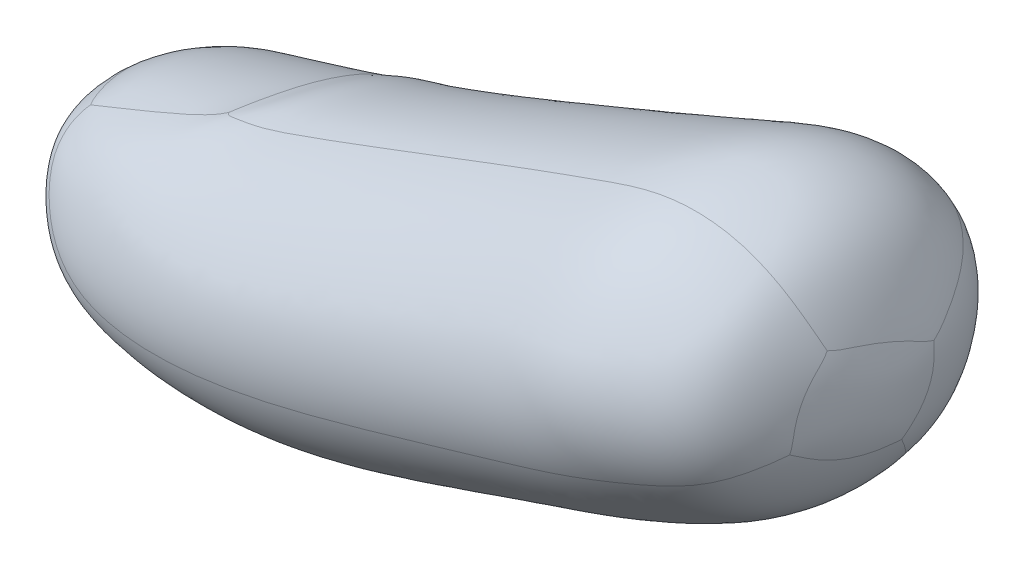
ISO-10303-21;
HEADER;
FILE_DESCRIPTION(('STEP AP214'),'2;1');
FILE_NAME('part.step','',(''),(''),'','','');
FILE_SCHEMA(('AUTOMOTIVE_DESIGN { 1 0 10303 214 1 1 1 1 }'));
ENDSEC;
DATA;
#1=APPLICATION_CONTEXT('core data for automotive mechanical design processes');
#2=APPLICATION_PROTOCOL_DEFINITION('international standard','automotive_design',2000,#1);
#3=PRODUCT_CONTEXT('',#1,'mechanical');
#4=PRODUCT('Part','Part','',(#3));
#5=PRODUCT_RELATED_PRODUCT_CATEGORY('part','',(#4));
#6=PRODUCT_DEFINITION_FORMATION('','',#4);
#7=PRODUCT_DEFINITION_CONTEXT('part definition',#1,'design');
#8=PRODUCT_DEFINITION('design','',#6,#7);
#9=PRODUCT_DEFINITION_SHAPE('','',#8);
#10=(LENGTH_UNIT() NAMED_UNIT(*) SI_UNIT(.MILLI.,.METRE.));
#11=(NAMED_UNIT(*) PLANE_ANGLE_UNIT() SI_UNIT($,.RADIAN.));
#12=(NAMED_UNIT(*) SI_UNIT($,.STERADIAN.) SOLID_ANGLE_UNIT());
#13=UNCERTAINTY_MEASURE_WITH_UNIT(LENGTH_MEASURE(1.E-05),#10,'distance_accuracy_value','');
#14=(GEOMETRIC_REPRESENTATION_CONTEXT(3) GLOBAL_UNCERTAINTY_ASSIGNED_CONTEXT((#13)) GLOBAL_UNIT_ASSIGNED_CONTEXT((#10,
#11,#12)) REPRESENTATION_CONTEXT('',''));
#15=CARTESIAN_POINT('',(0.,0.,0.));
#16=DIRECTION('',(0.,0.,1.));
#17=DIRECTION('',(1.,0.,0.));
#18=AXIS2_PLACEMENT_3D('',#15,#16,#17);
#19=CARTESIAN_POINT('',(-797.41223653979,1287.17299895486,-62.9935891354921));
#20=CARTESIAN_POINT('',(-797.009662963599,1287.28519680311,-63.2002993937446));
#21=CARTESIAN_POINT('',(-795.672419086408,1287.63969347436,-63.3725018589714));
#22=CARTESIAN_POINT('',(-793.668841404757,1288.33763641961,-63.5268892511794));
#23=CARTESIAN_POINT('',(-793.142389482528,1288.6110869806,-63.5393623579431));
#24=CARTESIAN_POINT('',(-792.963419483738,1288.79228448223,-63.4308098819067));
#25=CARTESIAN_POINT('',(-797.533078305331,1286.83508857179,-63.0166200379873));
#26=CARTESIAN_POINT('',(-796.84877291847,1286.72157388521,-63.4530714570095));
#27=CARTESIAN_POINT('',(-795.442847496479,1287.08382219586,-63.7313881127067));
#28=CARTESIAN_POINT('',(-793.53760208991,1287.88568427165,-63.9227970151909));
#29=CARTESIAN_POINT('',(-793.112873406118,1288.25916891389,-63.904342962774));
#30=CARTESIAN_POINT('',(-792.859176446138,1288.70692419971,-63.5590239463257));
#31=CARTESIAN_POINT('',(-798.165505891494,1285.49903019368,-62.521270285188));
#32=CARTESIAN_POINT('',(-797.288529056278,1285.50314502233,-63.1310010997051));
#33=CARTESIAN_POINT('',(-795.183320317249,1285.97390861126,-63.8174882878601));
#34=CARTESIAN_POINT('',(-793.156228824508,1287.31911805233,-64.1228957752211));
#35=CARTESIAN_POINT('',(-792.618550788941,1288.21587504562,-63.9979728594162));
#36=CARTESIAN_POINT('',(-792.359676645059,1288.79024346393,-63.6234619384396));
#37=CARTESIAN_POINT('',(-796.351515068194,1282.97871649903,-61.0308385031853));
#38=CARTESIAN_POINT('',(-795.493855054974,1283.30610138635,-61.9120081542899));
#39=CARTESIAN_POINT('',(-793.543550147985,1284.60379174971,-63.5074514996559));
#40=CARTESIAN_POINT('',(-792.007881748042,1286.74300828831,-64.3461099508554));
#41=CARTESIAN_POINT('',(-791.509320708268,1288.24636633131,-64.1023084785329));
#42=CARTESIAN_POINT('',(-791.326449599629,1288.95660443085,-63.6946496232852));
#43=CARTESIAN_POINT('',(-793.612528855527,1281.80148716396,-60.0658172232996));
#44=CARTESIAN_POINT('',(-793.070136415164,1282.20150433369,-61.0724770976875));
#45=CARTESIAN_POINT('',(-791.543687196439,1283.86335783618,-63.0561442141634));
#46=CARTESIAN_POINT('',(-790.525541028584,1286.51484311122,-64.4438423973524));
#47=CARTESIAN_POINT('',(-790.320842522823,1288.34953054084,-64.1561508918279));
#48=CARTESIAN_POINT('',(-790.234933903867,1289.13752980326,-63.7339954386459));
#49=CARTESIAN_POINT('',(-789.454731134139,1281.9841786437,-59.9815852341515));
#50=CARTESIAN_POINT('',(-789.182559879398,1282.39185351471,-61.0839265259536));
#51=CARTESIAN_POINT('',(-788.691089132263,1283.8240095798,-63.0913888586139));
#52=CARTESIAN_POINT('',(-788.103583179572,1287.18380093155,-64.6537649243692));
#53=CARTESIAN_POINT('',(-787.899541614799,1289.07672601446,-64.2872535256232));
#54=CARTESIAN_POINT('',(-787.860863143655,1289.8746764999,-63.8408280893228));
#55=CARTESIAN_POINT('',(-785.098427004622,1282.94687784199,-60.4267961981447));
#56=CARTESIAN_POINT('',(-784.864957655982,1283.43806064811,-61.5789093934558));
#57=CARTESIAN_POINT('',(-784.495419222226,1284.98028149854,-63.5571619268485));
#58=CARTESIAN_POINT('',(-784.042816514749,1288.47417911615,-64.9203931887374));
#59=CARTESIAN_POINT('',(-783.984411753044,1290.44048873931,-64.4846431832493));
#60=CARTESIAN_POINT('',(-784.004087314472,1291.26005135395,-64.0180470297201));
#61=CARTESIAN_POINT('',(-780.614340868256,1284.44028985914,-60.9278201320146));
#62=CARTESIAN_POINT('',(-780.357647619007,1284.97629042749,-62.0735339559628));
#63=CARTESIAN_POINT('',(-779.86755179198,1286.60740330709,-63.94963899637));
#64=CARTESIAN_POINT('',(-779.035374197738,1290.30737172252,-65.1328677179104));
#65=CARTESIAN_POINT('',(-778.752429589177,1292.43373590267,-64.6815991938362));
#66=CARTESIAN_POINT('',(-778.741061202132,1293.30012795418,-64.2018212301244));
#67=CARTESIAN_POINT('',(-776.227744159065,1286.03490554382,-61.283882648179));
#68=CARTESIAN_POINT('',(-776.04391254579,1286.54775291902,-62.4092558011296));
#69=CARTESIAN_POINT('',(-775.696975284693,1288.09372117291,-64.1795869377831));
#70=CARTESIAN_POINT('',(-775.698628608873,1291.47270776986,-65.1978612227999));
#71=CARTESIAN_POINT('',(-775.550967597177,1293.61740824296,-64.7305176424093));
#72=CARTESIAN_POINT('',(-775.60049049293,1294.5082313703,-64.2386288517891));
#73=CARTESIAN_POINT('',(-773.196398259698,1287.09374037915,-61.3926094458694));
#74=CARTESIAN_POINT('',(-773.053780970017,1287.57992354266,-62.5203265404129));
#75=CARTESIAN_POINT('',(-772.795140347196,1289.02917973234,-64.2710276657517));
#76=CARTESIAN_POINT('',(-772.361797568962,1292.63804382509,-65.2628436208054));
#77=CARTESIAN_POINT('',(-772.349476976405,1294.80108012848,-64.7794337162245));
#78=CARTESIAN_POINT('',(-772.459904518622,1295.71633758827,-64.2754371871515));
#79=CARTESIAN_POINT('',(-770.726393127656,1288.02325979308,-61.0056570959923));
#80=CARTESIAN_POINT('',(-770.598341033351,1288.45975276591,-62.0181251606208));
#81=CARTESIAN_POINT('',(-770.366115590796,1289.76088958678,-63.5899068385854));
#82=CARTESIAN_POINT('',(-769.977003930839,1293.00093857234,-64.4803545246217));
#83=CARTESIAN_POINT('',(-769.965975121647,1294.94293116809,-64.0463529760575));
#84=CARTESIAN_POINT('',(-770.06512929119,1295.76465653854,-63.5938637896889));
#85=CARTESIAN_POINT('',(-768.663995236277,1289.10097557716,-60.0497751628274));
#86=CARTESIAN_POINT('',(-768.565724787693,1289.4329930005,-60.8516191493285));
#87=CARTESIAN_POINT('',(-768.387501814803,1290.43280102252,-62.1143064819325));
#88=CARTESIAN_POINT('',(-768.330931380667,1292.9199719392,-62.845311782667));
#89=CARTESIAN_POINT('',(-768.326612022491,1294.42002745158,-62.4748152107174));
#90=CARTESIAN_POINT('',(-768.399576072669,1295.06081669551,-62.1048173319555));
#91=CARTESIAN_POINT('',(-767.980617683395,1290.55939492903,-59.0650601909013));
#92=CARTESIAN_POINT('',(-767.934242206241,1290.73886862783,-59.5505069520397));
#93=CARTESIAN_POINT('',(-767.834884337309,1291.37922379919,-60.26604517765));
#94=CARTESIAN_POINT('',(-767.672012670562,1292.92353313764,-60.7310358847111));
#95=CARTESIAN_POINT('',(-767.660284262554,1293.81482003253,-60.5661024453015));
#96=CARTESIAN_POINT('',(-767.691224220742,1294.18111896036,-60.3226256757653));
#97=CARTESIAN_POINT('',(-767.858716914211,1290.86486395098,-58.8563385306816));
#98=CARTESIAN_POINT('',(-767.774578791038,1291.10733531136,-58.9947010811301));
#99=CARTESIAN_POINT('',(-767.68045833405,1291.71791212349,-59.5459108477235));
#100=CARTESIAN_POINT('',(-767.556944119164,1292.98712365776,-59.9480548744773));
#101=CARTESIAN_POINT('',(-767.557588531359,1293.73533754585,-59.8964874238842));
#102=CARTESIAN_POINT('',(-767.612447080552,1294.00603099329,-59.9573745846767));
#103=(BOUNDED_SURFACE() B_SPLINE_SURFACE(3,3,((#19,#20,#21,#22,#23,#24),(#25,#26,#27,#28,#29,
#30),(#31,#32,#33,#34,#35,#36),(#37,#38,#39,#40,#41,#42),(#43,#44,#45,#46,#47,#48),(#49,#50,#51,
#52,#53,#54),(#55,#56,#57,#58,#59,#60),(#61,#62,#63,#64,#65,#66),(#67,#68,#69,#70,#71,#72),(#73,
#74,#75,#76,#77,#78),(#79,#80,#81,#82,#83,#84),(#85,#86,#87,#88,#89,#90),(#91,#92,#93,#94,#95,
#96),(#97,#98,#99,#100,#101,#102)),.UNSPECIFIED.,.F.,.F.,.F.) B_SPLINE_SURFACE_WITH_KNOTS((4,1,
1,1,1,1,1,1,1,1,1,4),(4,1,1,4),(0.,1.,2.,3.,4.,5.,6.,7.,8.,9.,10.,11.),(0.,1.,2.,3.),
.UNSPECIFIED.) GEOMETRIC_REPRESENTATION_ITEM() RATIONAL_B_SPLINE_SURFACE(((0.75,1.,1.,1.,1.,
0.75),(1.,1.,1.,1.,1.,1.),(1.,1.,1.,1.,1.,1.),(1.,1.,1.,1.,1.,1.),(1.,1.,1.,1.,1.,1.),(1.,1.,1.,
1.,1.,1.),(1.,1.,1.,1.,1.,1.),(1.,1.,1.,1.,1.,1.),(1.,1.,1.,1.,1.,1.),(1.,1.,1.,1.,1.,1.),(1.,
1.,1.,1.,1.,1.),(1.,1.,1.,1.,1.,1.),(1.,1.,1.,1.,1.,1.),(0.75,1.,1.,1.,1.,0.75))) REPRESENTATION_ITEM('') SURFACE());
#104=CARTESIAN_POINT('',(-767.858716914211,1290.86486395098,-58.8563385306816));
#105=CARTESIAN_POINT('',(-767.980617683395,1290.55939492903,-59.0650601909013));
#106=CARTESIAN_POINT('',(-768.663995236277,1289.10097557716,-60.0497751628274));
#107=CARTESIAN_POINT('',(-770.726393127656,1288.02325979308,-61.0056570959923));
#108=CARTESIAN_POINT('',(-773.196398259698,1287.09374037915,-61.3926094458694));
#109=CARTESIAN_POINT('',(-776.227744159065,1286.03490554382,-61.283882648179));
#110=CARTESIAN_POINT('',(-780.614340868256,1284.44028985914,-60.9278201320146));
#111=CARTESIAN_POINT('',(-785.098427004622,1282.94687784199,-60.4267961981447));
#112=CARTESIAN_POINT('',(-789.454731134139,1281.9841786437,-59.9815852341515));
#113=CARTESIAN_POINT('',(-793.612528855527,1281.80148716396,-60.0658172232996));
#114=CARTESIAN_POINT('',(-796.351515068194,1282.97871649903,-61.0308385031853));
#115=CARTESIAN_POINT('',(-798.165505891494,1285.49903019368,-62.521270285188));
#116=CARTESIAN_POINT('',(-797.533078305331,1286.83508857179,-63.0166200379873));
#117=CARTESIAN_POINT('',(-797.41223653979,1287.17299895486,-62.9935891354921));
#118=(BOUNDED_CURVE() B_SPLINE_CURVE(3,(#104,#105,#106,#107,#108,#109,#110,#111,#112,#113,#114,
#115,#116,#117),.UNSPECIFIED.,.F.,.F.) B_SPLINE_CURVE_WITH_KNOTS((4,1,1,1,1,1,1,1,1,1,1,4),(0.,
1.,2.,3.,4.,5.,6.,7.,8.,9.,10.,11.),
.UNSPECIFIED.) CURVE() GEOMETRIC_REPRESENTATION_ITEM() RATIONAL_B_SPLINE_CURVE((0.75,1.,1.,1.,
1.,1.,1.,1.,1.,1.,1.,1.,1.,0.75)) REPRESENTATION_ITEM(''));
#119=CARTESIAN_POINT('',(-767.858716914211,1290.86486395098,-58.8563385306816));
#120=VERTEX_POINT('',#119);
#121=CARTESIAN_POINT('',(-797.41223653979,1287.17299895486,-62.9935891354921));
#122=VERTEX_POINT('',#121);
#123=EDGE_CURVE('E90',#120,#122,#118,.T.);
#124=CARTESIAN_POINT('',(-797.41223653979,1287.17299895486,-62.9935891354921));
#125=CARTESIAN_POINT('',(-797.009662963599,1287.28519680311,-63.2002993937446));
#126=CARTESIAN_POINT('',(-795.672419086408,1287.63969347436,-63.3725018589714));
#127=CARTESIAN_POINT('',(-793.668841404757,1288.33763641961,-63.5268892511794));
#128=CARTESIAN_POINT('',(-793.142389482528,1288.6110869806,-63.5393623579431));
#129=CARTESIAN_POINT('',(-792.963419483738,1288.79228448223,-63.4308098819067));
#130=(BOUNDED_CURVE() B_SPLINE_CURVE(3,(#124,#125,#126,#127,#128,#129),.UNSPECIFIED.,.F.,
.F.) B_SPLINE_CURVE_WITH_KNOTS((4,1,1,4),(0.,1.,2.,3.),
.UNSPECIFIED.) CURVE() GEOMETRIC_REPRESENTATION_ITEM() RATIONAL_B_SPLINE_CURVE((0.75,1.,1.,1.,
1.,0.75)) REPRESENTATION_ITEM(''));
#131=CARTESIAN_POINT('',(-792.963419483738,1288.79228448223,-63.4308098819067));
#132=VERTEX_POINT('',#131);
#133=EDGE_CURVE('E75',#122,#132,#130,.T.);
#134=CARTESIAN_POINT('',(-792.963419483738,1288.79228448223,-63.4308098819067));
#135=CARTESIAN_POINT('',(-792.859176446138,1288.70692419971,-63.5590239463257));
#136=CARTESIAN_POINT('',(-792.359676645059,1288.79024346393,-63.6234619384396));
#137=CARTESIAN_POINT('',(-791.326449599629,1288.95660443085,-63.6946496232852));
#138=CARTESIAN_POINT('',(-790.234933903867,1289.13752980326,-63.7339954386459));
#139=CARTESIAN_POINT('',(-787.860863143655,1289.8746764999,-63.8408280893228));
#140=CARTESIAN_POINT('',(-784.004087314472,1291.26005135395,-64.0180470297201));
#141=CARTESIAN_POINT('',(-778.741061202132,1293.30012795418,-64.2018212301244));
#142=CARTESIAN_POINT('',(-775.60049049293,1294.5082313703,-64.2386288517891));
#143=CARTESIAN_POINT('',(-772.459904518622,1295.71633758827,-64.2754371871515));
#144=CARTESIAN_POINT('',(-770.06512929119,1295.76465653854,-63.5938637896889));
#145=CARTESIAN_POINT('',(-768.399576072669,1295.06081669551,-62.1048173319555));
#146=CARTESIAN_POINT('',(-767.691224220742,1294.18111896036,-60.3226256757653));
#147=CARTESIAN_POINT('',(-767.612447080552,1294.00603099329,-59.9573745846767));
#148=(BOUNDED_CURVE() B_SPLINE_CURVE(3,(#134,#135,#136,#137,#138,#139,#140,#141,#142,#143,#144,
#145,#146,#147),.UNSPECIFIED.,.F.,.F.) B_SPLINE_CURVE_WITH_KNOTS((4,1,1,1,1,1,1,1,1,1,1,4),(0.,
1.,2.,3.,4.,5.,6.,7.,8.,9.,10.,11.),
.UNSPECIFIED.) CURVE() GEOMETRIC_REPRESENTATION_ITEM() RATIONAL_B_SPLINE_CURVE((0.75,1.,1.,1.,
1.,1.,1.,1.,1.,1.,1.,1.,1.,0.75)) REPRESENTATION_ITEM(''));
#149=CARTESIAN_POINT('',(-767.612447080552,1294.00603099329,-59.9573745846767));
#150=VERTEX_POINT('',#149);
#151=EDGE_CURVE('E105',#132,#150,#148,.T.);
#152=CARTESIAN_POINT('',(-767.858716914211,1290.86486395098,-58.8563385306816));
#153=CARTESIAN_POINT('',(-767.774578791038,1291.10733531136,-58.9947010811301));
#154=CARTESIAN_POINT('',(-767.68045833405,1291.71791212349,-59.5459108477235));
#155=CARTESIAN_POINT('',(-767.556944119164,1292.98712365776,-59.9480548744773));
#156=CARTESIAN_POINT('',(-767.557588531359,1293.73533754585,-59.8964874238842));
#157=CARTESIAN_POINT('',(-767.612447080552,1294.00603099329,-59.9573745846767));
#158=(BOUNDED_CURVE() B_SPLINE_CURVE(3,(#152,#153,#154,#155,#156,#157),.UNSPECIFIED.,.F.,
.F.) B_SPLINE_CURVE_WITH_KNOTS((4,1,1,4),(0.,1.,2.,3.),
.UNSPECIFIED.) CURVE() GEOMETRIC_REPRESENTATION_ITEM() RATIONAL_B_SPLINE_CURVE((0.75,1.,1.,1.,
1.,0.75)) REPRESENTATION_ITEM(''));
#159=EDGE_CURVE('E93',#150,#120,#158,.F.);
#160=ORIENTED_EDGE('',*,*,#123,.T.);
#161=ORIENTED_EDGE('',*,*,#133,.T.);
#162=ORIENTED_EDGE('',*,*,#151,.T.);
#163=ORIENTED_EDGE('',*,*,#159,.T.);
#164=EDGE_LOOP('',(#160,#161,#162,#163));
#165=FACE_BOUND('',#164,.T.);
#166=ADVANCED_FACE('F33',(#165),#103,.F.);
#167=CARTESIAN_POINT('',(-767.858716914211,1290.86486395098,-58.8563385306816));
#168=CARTESIAN_POINT('',(-767.774578791038,1291.10733531136,-58.9947010811301));
#169=CARTESIAN_POINT('',(-767.68045833405,1291.71791212349,-59.5459108477235));
#170=CARTESIAN_POINT('',(-767.556944119164,1292.98712365776,-59.9480548744773));
#171=CARTESIAN_POINT('',(-767.557588531359,1293.73533754585,-59.8964874238842));
#172=CARTESIAN_POINT('',(-767.612447080552,1294.00603099329,-59.9573745846767));
#173=CARTESIAN_POINT('',(-767.820954268173,1290.92786161256,-58.5092543199808));
#174=CARTESIAN_POINT('',(-767.614915375833,1291.47580199488,-58.4388952102314));
#175=CARTESIAN_POINT('',(-767.526032330791,1292.05660044781,-58.8257765177861));
#176=CARTESIAN_POINT('',(-767.441875567766,1293.05071417789,-59.1650738642435));
#177=CARTESIAN_POINT('',(-767.454892800163,1293.65585505917,-59.2268724024669));
#178=CARTESIAN_POINT('',(-767.588528489555,1294.10163647368,-59.6530106543697));
#179=CARTESIAN_POINT('',(-767.860440748285,1290.97308735402,-57.4350742673072));
#180=CARTESIAN_POINT('',(-767.607744296452,1291.64379310166,-57.5167839238708));
#181=CARTESIAN_POINT('',(-767.460945795234,1292.46493096839,-57.7935005023082));
#182=CARTESIAN_POINT('',(-767.41166965352,1293.32531178539,-58.1345096436654));
#183=CARTESIAN_POINT('',(-767.481587216558,1293.96692925695,-58.4442090046586));
#184=CARTESIAN_POINT('',(-767.669619818126,1294.54412798076,-58.8571921361414));
#185=CARTESIAN_POINT('',(-768.049070594386,1291.47210496343,-55.7503315317923));
#186=CARTESIAN_POINT('',(-767.764077573183,1292.06448029126,-56.1210180395691));
#187=CARTESIAN_POINT('',(-767.619089276518,1292.8448329563,-56.4848029411818));
#188=CARTESIAN_POINT('',(-767.587853958583,1293.77393648092,-56.9202859708017));
#189=CARTESIAN_POINT('',(-767.684518558303,1294.36858647968,-57.1966052727144));
#190=CARTESIAN_POINT('',(-767.923428278138,1294.99045316303,-57.3963183795086));
#191=CARTESIAN_POINT('',(-768.162632713578,1292.07764881348,-54.8915966453215));
#192=CARTESIAN_POINT('',(-767.928449386946,1292.48679480355,-55.3049553025182));
#193=CARTESIAN_POINT('',(-767.894480921089,1293.18028633337,-55.4385124594952));
#194=CARTESIAN_POINT('',(-767.884798688657,1294.14397141874,-55.9469032064313));
#195=CARTESIAN_POINT('',(-767.904043249297,1294.58078387283,-56.366321828175));
#196=CARTESIAN_POINT('',(-768.132471475574,1295.11440624349,-56.4347229917651));
#197=CARTESIAN_POINT('',(-768.257645369836,1292.23475085663,-54.5963084958512));
#198=CARTESIAN_POINT('',(-768.188060034648,1292.51787487326,-54.6553437497144));
#199=CARTESIAN_POINT('',(-768.190554231571,1293.35068616389,-54.7003200549341));
#200=CARTESIAN_POINT('',(-768.188942105985,1294.54509880206,-55.3643513235413));
#201=CARTESIAN_POINT('',(-768.187596063127,1295.00339063332,-55.9656843174954));
#202=CARTESIAN_POINT('',(-768.245363942696,1295.21826996027,-56.1448309301154));
#203=(BOUNDED_SURFACE() B_SPLINE_SURFACE(3,3,((#167,#168,#169,#170,#171,#172),(#173,#174,#175,
#176,#177,#178),(#179,#180,#181,#182,#183,#184),(#185,#186,#187,#188,#189,#190),(#191,#192,#193,
#194,#195,#196),(#197,#198,#199,#200,#201,#202)),.UNSPECIFIED.,.F.,.F.,
.F.) B_SPLINE_SURFACE_WITH_KNOTS((4,1,1,4),(4,1,1,4),(0.,1.,2.,3.),(0.,1.,2.,3.),
.UNSPECIFIED.) GEOMETRIC_REPRESENTATION_ITEM() RATIONAL_B_SPLINE_SURFACE(((0.75,1.,1.,1.,1.,
0.75),(1.,1.,1.,1.,1.,1.),(1.,1.,1.,1.,1.,1.),(1.,1.,1.,1.,1.,1.),(1.,1.,1.,1.,1.,1.),(0.75,1.,
1.,1.,1.,0.75))) REPRESENTATION_ITEM('') SURFACE());
#204=CARTESIAN_POINT('',(-767.858716914211,1290.86486395098,-58.8563385306816));
#205=CARTESIAN_POINT('',(-767.820954268173,1290.92786161256,-58.5092543199808));
#206=CARTESIAN_POINT('',(-767.860440748285,1290.97308735402,-57.4350742673072));
#207=CARTESIAN_POINT('',(-768.049070594386,1291.47210496343,-55.7503315317923));
#208=CARTESIAN_POINT('',(-768.162632713578,1292.07764881348,-54.8915966453215));
#209=CARTESIAN_POINT('',(-768.257645369836,1292.23475085663,-54.5963084958512));
#210=(BOUNDED_CURVE() B_SPLINE_CURVE(3,(#204,#205,#206,#207,#208,#209),.UNSPECIFIED.,.F.,
.F.) B_SPLINE_CURVE_WITH_KNOTS((4,1,1,4),(0.,1.,2.,3.),
.UNSPECIFIED.) CURVE() GEOMETRIC_REPRESENTATION_ITEM() RATIONAL_B_SPLINE_CURVE((0.75,1.,1.,1.,
1.,0.75)) REPRESENTATION_ITEM(''));
#211=CARTESIAN_POINT('',(-768.257645369835,1292.23475085663,-54.5963084958512));
#212=VERTEX_POINT('',#211);
#213=EDGE_CURVE('E85',#212,#120,#210,.F.);
#214=CARTESIAN_POINT('',(-767.612447080552,1294.00603099329,-59.9573745846767));
#215=CARTESIAN_POINT('',(-767.588528489555,1294.10163647368,-59.6530106543697));
#216=CARTESIAN_POINT('',(-767.669619818126,1294.54412798076,-58.8571921361414));
#217=CARTESIAN_POINT('',(-767.923428278138,1294.99045316303,-57.3963183795086));
#218=CARTESIAN_POINT('',(-768.132471475574,1295.11440624349,-56.4347229917651));
#219=CARTESIAN_POINT('',(-768.245363942696,1295.21826996027,-56.1448309301154));
#220=(BOUNDED_CURVE() B_SPLINE_CURVE(3,(#214,#215,#216,#217,#218,#219),.UNSPECIFIED.,.F.,
.F.) B_SPLINE_CURVE_WITH_KNOTS((4,1,1,4),(0.,1.,2.,3.),
.UNSPECIFIED.) CURVE() GEOMETRIC_REPRESENTATION_ITEM() RATIONAL_B_SPLINE_CURVE((0.75,1.,1.,1.,
1.,0.75)) REPRESENTATION_ITEM(''));
#221=CARTESIAN_POINT('',(-768.245363942696,1295.21826996027,-56.1448309301153));
#222=VERTEX_POINT('',#221);
#223=EDGE_CURVE('E112',#150,#222,#220,.T.);
#224=CARTESIAN_POINT('',(-768.257645369836,1292.23475085663,-54.5963084958512));
#225=CARTESIAN_POINT('',(-768.188060034648,1292.51787487326,-54.6553437497144));
#226=CARTESIAN_POINT('',(-768.190554231571,1293.35068616389,-54.7003200549341));
#227=CARTESIAN_POINT('',(-768.188942105985,1294.54509880206,-55.3643513235413));
#228=CARTESIAN_POINT('',(-768.187596063127,1295.00339063332,-55.9656843174954));
#229=CARTESIAN_POINT('',(-768.245363942696,1295.21826996027,-56.1448309301154));
#230=(BOUNDED_CURVE() B_SPLINE_CURVE(3,(#224,#225,#226,#227,#228,#229),.UNSPECIFIED.,.F.,
.F.) B_SPLINE_CURVE_WITH_KNOTS((4,1,1,4),(0.,1.,2.,3.),
.UNSPECIFIED.) CURVE() GEOMETRIC_REPRESENTATION_ITEM() RATIONAL_B_SPLINE_CURVE((0.75,1.,1.,1.,
1.,0.75)) REPRESENTATION_ITEM(''));
#231=EDGE_CURVE('E54',#222,#212,#230,.F.);
#232=ORIENTED_EDGE('',*,*,#213,.T.);
#233=ORIENTED_EDGE('',*,*,#159,.F.);
#234=ORIENTED_EDGE('',*,*,#223,.T.);
#235=ORIENTED_EDGE('',*,*,#231,.T.);
#236=EDGE_LOOP('',(#232,#233,#234,#235));
#237=FACE_BOUND('',#236,.T.);
#238=ADVANCED_FACE('F166',(#237),#203,.F.);
#239=CARTESIAN_POINT('',(-792.963419483738,1288.79228448223,-63.4308098819067));
#240=CARTESIAN_POINT('',(-792.888692522547,1289.05884226641,-63.1940433414839));
#241=CARTESIAN_POINT('',(-792.405533788697,1290.44979971617,-61.8294860734332));
#242=CARTESIAN_POINT('',(-792.471508457402,1291.54753107883,-58.6683872456036));
#243=CARTESIAN_POINT('',(-793.012090241742,1291.39643204746,-56.5686000588031));
#244=CARTESIAN_POINT('',(-793.136797075662,1291.34153504251,-56.1777845356879));
#245=CARTESIAN_POINT('',(-792.859176446138,1288.70692419971,-63.5590239463257));
#246=CARTESIAN_POINT('',(-792.605479486147,1289.15467948552,-63.2137049298555));
#247=CARTESIAN_POINT('',(-792.015420329977,1290.57221598653,-61.8508829164464));
#248=CARTESIAN_POINT('',(-792.0682472325,1291.69096413703,-58.7097057405986));
#249=CARTESIAN_POINT('',(-792.694499514472,1291.52340807774,-56.5967807110266));
#250=CARTESIAN_POINT('',(-793.040355128991,1291.37757455518,-55.9964671002421));
#251=CARTESIAN_POINT('',(-792.359676645059,1288.79024346393,-63.6234619384396));
#252=CARTESIAN_POINT('',(-792.100802501186,1289.36461188225,-63.2489510174412));
#253=CARTESIAN_POINT('',(-791.602983961261,1290.76532856224,-61.8758302492854));
#254=CARTESIAN_POINT('',(-791.70028719864,1291.87456590464,-58.7486357557308));
#255=CARTESIAN_POINT('',(-792.310309970548,1291.72403638306,-56.6294691344165));
#256=CARTESIAN_POINT('',(-792.677334488182,1291.50749472503,-55.9118700668459));
#257=CARTESIAN_POINT('',(-791.326449599629,1288.95660443085,-63.6946496232852));
#258=CARTESIAN_POINT('',(-791.143578491009,1289.6668425304,-63.2869907680374));
#259=CARTESIAN_POINT('',(-790.910655096256,1291.0044368856,-61.900156819369));
#260=CARTESIAN_POINT('',(-791.041192387042,1292.10652067138,-58.7834279085633));
#261=CARTESIAN_POINT('',(-791.639100072375,1291.96876129559,-56.6595867789358));
#262=CARTESIAN_POINT('',(-791.958839870789,1291.6981313765,-55.8146051566991));
#263=CARTESIAN_POINT('',(-790.234933903867,1289.13752980326,-63.7339954386459));
#264=CARTESIAN_POINT('',(-790.149025284912,1289.92552906569,-63.3118399854639));
#265=CARTESIAN_POINT('',(-790.010089314861,1291.24283868574,-61.9109096782604));
#266=CARTESIAN_POINT('',(-790.219774540712,1292.32548846123,-58.811103698913));
#267=CARTESIAN_POINT('',(-790.757728829759,1292.22262483803,-56.6797027364767));
#268=CARTESIAN_POINT('',(-791.033194145582,1291.93694393439,-55.7655573934477));
#269=CARTESIAN_POINT('',(-787.860863143655,1289.8746764999,-63.8408280893228));
#270=CARTESIAN_POINT('',(-787.82218467251,1290.67262698534,-63.3944026530225));
#271=CARTESIAN_POINT('',(-787.871512352735,1291.9715038442,-61.9752123065995));
#272=CARTESIAN_POINT('',(-788.100152141968,1293.03709060229,-58.892312865551));
#273=CARTESIAN_POINT('',(-788.553990297404,1292.96632357885,-56.7462472668765));
#274=CARTESIAN_POINT('',(-788.790384601963,1292.70498299198,-55.8116687060021));
#275=CARTESIAN_POINT('',(-784.004087314472,1291.26005135395,-64.0180470297201));
#276=CARTESIAN_POINT('',(-784.023762875899,1292.07961396857,-63.5514508761909));
#277=CARTESIAN_POINT('',(-784.160869883297,1293.39155480397,-62.1208162675514));
#278=CARTESIAN_POINT('',(-784.678223037182,1294.29014873968,-59.0232983283016));
#279=CARTESIAN_POINT('',(-785.140248631718,1294.19285241321,-56.8594035811445));
#280=CARTESIAN_POINT('',(-785.360169400154,1293.94228311116,-55.8873619915583));
#281=CARTESIAN_POINT('',(-778.741061202132,1293.30012795418,-64.2018212301244));
#282=CARTESIAN_POINT('',(-778.729692815097,1294.16652000568,-63.7220432663907));
#283=CARTESIAN_POINT('',(-778.967163875526,1295.50572403158,-62.2541999355301));
#284=CARTESIAN_POINT('',(-779.61235639276,1296.34448008759,-59.0441463016271));
#285=CARTESIAN_POINT('',(-780.151485911413,1296.18389050033,-56.7978263603931));
#286=CARTESIAN_POINT('',(-780.42055853575,1295.89388800416,-55.7824007560304));
#287=CARTESIAN_POINT('',(-775.60049049293,1294.5082313703,-64.2386288517891));
#288=CARTESIAN_POINT('',(-775.650013388683,1295.39905449764,-63.746740061169));
#289=CARTESIAN_POINT('',(-775.995765983389,1296.8176465339,-62.2465284790681));
#290=CARTESIAN_POINT('',(-776.666386621411,1297.72937875317,-58.8887114096238));
#291=CARTESIAN_POINT('',(-777.098404347987,1297.52625141614,-56.5232935594187));
#292=CARTESIAN_POINT('',(-777.231136759519,1297.23675661351,-55.4605057625959));
#293=CARTESIAN_POINT('',(-772.459904518622,1295.71633758827,-64.2754371871515));
#294=CARTESIAN_POINT('',(-772.57033206083,1296.63159504805,-63.7714406580785));
#295=CARTESIAN_POINT('',(-773.024362822208,1298.1295885838,-62.2388644463566));
#296=CARTESIAN_POINT('',(-773.720411617317,1299.11429708066,-58.7332836094994));
#297=CARTESIAN_POINT('',(-774.045374640075,1298.86863236979,-56.2487741486124));
#298=CARTESIAN_POINT('',(-774.126505338641,1298.54840059337,-55.1485205596987));
#299=CARTESIAN_POINT('',(-770.06512929119,1295.76465653854,-63.5938637896889));
#300=CARTESIAN_POINT('',(-770.164283460724,1296.58638190898,-63.141374603342));
#301=CARTESIAN_POINT('',(-770.571928948068,1297.93129079501,-61.7654194064753));
#302=CARTESIAN_POINT('',(-771.196854733559,1298.81537390932,-58.6180907458877));
#303=CARTESIAN_POINT('',(-771.488559003114,1298.59481831421,-56.3874782283776));
#304=CARTESIAN_POINT('',(-771.561393860574,1298.30731311911,-55.3996634538021));
#305=CARTESIAN_POINT('',(-768.399576072669,1295.06081669551,-62.1048173319555));
#306=CARTESIAN_POINT('',(-768.472540122848,1295.70160593944,-61.7348194531936));
#307=CARTESIAN_POINT('',(-768.768715681722,1296.7647074028,-60.6253245100848));
#308=CARTESIAN_POINT('',(-769.021312277572,1297.50513658091,-58.1185646115561));
#309=CARTESIAN_POINT('',(-769.255368046297,1297.3457056427,-56.3573101879723));
#310=CARTESIAN_POINT('',(-769.320601743782,1297.12496634271,-55.5750451982881));
#311=CARTESIAN_POINT('',(-767.691224220742,1294.18111896036,-60.3226256757653));
#312=CARTESIAN_POINT('',(-767.722164178938,1294.54741788817,-60.0791489062508));
#313=CARTESIAN_POINT('',(-767.857652419703,1295.12132670456,-59.2701752676025));
#314=CARTESIAN_POINT('',(-768.162337997972,1295.61231984635,-57.5960314862919));
#315=CARTESIAN_POINT('',(-768.360899701841,1295.64802861414,-56.5031241553553));
#316=CARTESIAN_POINT('',(-768.416024289395,1295.537013004,-56.0340854810746));
#317=CARTESIAN_POINT('',(-767.612447080552,1294.00603099329,-59.9573745846767));
#318=CARTESIAN_POINT('',(-767.588528489555,1294.10163647368,-59.6530106543697));
#319=CARTESIAN_POINT('',(-767.669619818126,1294.54412798076,-58.8571921361414));
#320=CARTESIAN_POINT('',(-767.923428278138,1294.99045316303,-57.3963183795086));
#321=CARTESIAN_POINT('',(-768.132471475574,1295.11440624349,-56.4347229917651));
#322=CARTESIAN_POINT('',(-768.245363942696,1295.21826996027,-56.1448309301154));
#323=(BOUNDED_SURFACE() B_SPLINE_SURFACE(3,3,((#239,#240,#241,#242,#243,#244),(#245,#246,#247,
#248,#249,#250),(#251,#252,#253,#254,#255,#256),(#257,#258,#259,#260,#261,#262),(#263,#264,#265,
#266,#267,#268),(#269,#270,#271,#272,#273,#274),(#275,#276,#277,#278,#279,#280),(#281,#282,#283,
#284,#285,#286),(#287,#288,#289,#290,#291,#292),(#293,#294,#295,#296,#297,#298),(#299,#300,#301,
#302,#303,#304),(#305,#306,#307,#308,#309,#310),(#311,#312,#313,#314,#315,#316),(#317,#318,#319,
#320,#321,#322)),.UNSPECIFIED.,.F.,.F.,.F.) B_SPLINE_SURFACE_WITH_KNOTS((4,1,1,1,1,1,1,1,1,1,1,
4),(4,1,1,4),(0.,1.,2.,3.,4.,5.,6.,7.,8.,9.,10.,11.),(0.,1.,2.,3.),
.UNSPECIFIED.) GEOMETRIC_REPRESENTATION_ITEM() RATIONAL_B_SPLINE_SURFACE(((0.75,1.,1.,1.,1.,
0.75),(1.,1.,1.,1.,1.,1.),(1.,1.,1.,1.,1.,1.),(1.,1.,1.,1.,1.,1.),(1.,1.,1.,1.,1.,1.),(1.,1.,1.,
1.,1.,1.),(1.,1.,1.,1.,1.,1.),(1.,1.,1.,1.,1.,1.),(1.,1.,1.,1.,1.,1.),(1.,1.,1.,1.,1.,1.),(1.,
1.,1.,1.,1.,1.),(1.,1.,1.,1.,1.,1.),(1.,1.,1.,1.,1.,1.),(0.75,1.,1.,1.,1.,0.75))) REPRESENTATION_ITEM('') SURFACE());
#324=CARTESIAN_POINT('',(-792.963419483738,1288.79228448223,-63.4308098819067));
#325=CARTESIAN_POINT('',(-792.888692522547,1289.05884226641,-63.1940433414839));
#326=CARTESIAN_POINT('',(-792.405533788697,1290.44979971617,-61.8294860734332));
#327=CARTESIAN_POINT('',(-792.471508457402,1291.54753107883,-58.6683872456036));
#328=CARTESIAN_POINT('',(-793.012090241742,1291.39643204746,-56.5686000588031));
#329=CARTESIAN_POINT('',(-793.136797075662,1291.34153504251,-56.1777845356879));
#330=(BOUNDED_CURVE() B_SPLINE_CURVE(3,(#324,#325,#326,#327,#328,#329),.UNSPECIFIED.,.F.,
.F.) B_SPLINE_CURVE_WITH_KNOTS((4,1,1,4),(0.,1.,2.,3.),
.UNSPECIFIED.) CURVE() GEOMETRIC_REPRESENTATION_ITEM() RATIONAL_B_SPLINE_CURVE((0.75,1.,1.,1.,
1.,0.75)) REPRESENTATION_ITEM(''));
#331=CARTESIAN_POINT('',(-793.136797075662,1291.34153504251,-56.177784535688));
#332=VERTEX_POINT('',#331);
#333=EDGE_CURVE('E81',#132,#332,#330,.T.);
#334=CARTESIAN_POINT('',(-768.245363942696,1295.21826996027,-56.1448309301154));
#335=CARTESIAN_POINT('',(-768.416024289395,1295.537013004,-56.0340854810746));
#336=CARTESIAN_POINT('',(-769.320601743782,1297.12496634271,-55.5750451982881));
#337=CARTESIAN_POINT('',(-771.561393860574,1298.30731311911,-55.3996634538021));
#338=CARTESIAN_POINT('',(-774.126505338641,1298.54840059337,-55.1485205596987));
#339=CARTESIAN_POINT('',(-777.231136759519,1297.23675661351,-55.4605057625959));
#340=CARTESIAN_POINT('',(-780.42055853575,1295.89388800416,-55.7824007560304));
#341=CARTESIAN_POINT('',(-785.360169400154,1293.94228311116,-55.8873619915583));
#342=CARTESIAN_POINT('',(-788.790384601963,1292.70498299198,-55.8116687060021));
#343=CARTESIAN_POINT('',(-791.033194145582,1291.93694393439,-55.7655573934477));
#344=CARTESIAN_POINT('',(-791.958839870789,1291.6981313765,-55.8146051566991));
#345=CARTESIAN_POINT('',(-792.677334488182,1291.50749472503,-55.9118700668459));
#346=CARTESIAN_POINT('',(-793.040355128991,1291.37757455518,-55.9964671002421));
#347=CARTESIAN_POINT('',(-793.136797075662,1291.34153504251,-56.1777845356879));
#348=(BOUNDED_CURVE() B_SPLINE_CURVE(3,(#334,#335,#336,#337,#338,#339,#340,#341,#342,#343,#344,
#345,#346,#347),.UNSPECIFIED.,.F.,.F.) B_SPLINE_CURVE_WITH_KNOTS((4,1,1,1,1,1,1,1,1,1,1,4),(0.,
1.,2.,3.,4.,5.,6.,7.,8.,9.,10.,11.),
.UNSPECIFIED.) CURVE() GEOMETRIC_REPRESENTATION_ITEM() RATIONAL_B_SPLINE_CURVE((0.75,1.,1.,1.,
1.,1.,1.,1.,1.,1.,1.,1.,1.,0.75)) REPRESENTATION_ITEM(''));
#349=EDGE_CURVE('E95',#332,#222,#348,.F.);
#350=ORIENTED_EDGE('',*,*,#151,.F.);
#351=ORIENTED_EDGE('',*,*,#333,.T.);
#352=ORIENTED_EDGE('',*,*,#349,.T.);
#353=ORIENTED_EDGE('',*,*,#223,.F.);
#354=EDGE_LOOP('',(#350,#351,#352,#353));
#355=FACE_BOUND('',#354,.T.);
#356=ADVANCED_FACE('F164',(#355),#323,.F.);
#357=CARTESIAN_POINT('',(-797.41223653979,1287.17299895486,-62.9935891354921));
#358=CARTESIAN_POINT('',(-797.69396835045,1287.39871148968,-62.7638479747334));
#359=CARTESIAN_POINT('',(-798.901274572345,1288.32489642248,-61.363524159421));
#360=CARTESIAN_POINT('',(-799.315808396816,1289.26982338949,-57.9081307152901));
#361=CARTESIAN_POINT('',(-798.462785126624,1289.39498892249,-55.9026371769333));
#362=CARTESIAN_POINT('',(-798.213978641815,1289.41196073404,-55.4921453929561));
#363=CARTESIAN_POINT('',(-797.009662963599,1287.28519680311,-63.2002993937446));
#364=CARTESIAN_POINT('',(-797.170553008727,1287.84881972098,-62.9475273305015));
#365=CARTESIAN_POINT('',(-798.253869327058,1288.88488252966,-61.6143687201919));
#366=CARTESIAN_POINT('',(-798.622425681484,1289.79956497729,-58.1552748387873));
#367=CARTESIAN_POINT('',(-797.938932700607,1289.79534740602,-56.141698223242));
#368=CARTESIAN_POINT('',(-797.827649186406,1289.62062588158,-55.4064300241382));
#369=CARTESIAN_POINT('',(-795.672419086408,1287.63969347436,-63.3725018589714));
#370=CARTESIAN_POINT('',(-795.901990676336,1288.19556475289,-63.0136156052361));
#371=CARTESIAN_POINT('',(-796.560749856792,1289.30913628233,-61.664170765459));
#372=CARTESIAN_POINT('',(-796.816483228828,1290.29269365849,-58.2928725625739));
#373=CARTESIAN_POINT('',(-796.465098388701,1290.27181824727,-56.2565117080518));
#374=CARTESIAN_POINT('',(-796.331736929728,1290.18286090178,-55.4701276915806));
#375=CARTESIAN_POINT('',(-793.668841404757,1288.33763641961,-63.5268892511794));
#376=CARTESIAN_POINT('',(-793.800080719594,1288.78958856756,-63.1309814871787));
#377=CARTESIAN_POINT('',(-793.943664713588,1290.03083094006,-61.7474491911735));
#378=CARTESIAN_POINT('',(-794.119854548099,1291.01396755546,-58.5007247858701));
#379=CARTESIAN_POINT('',(-794.215854334166,1290.96218020134,-56.4603852210648));
#380=CARTESIAN_POINT('',(-794.179617626879,1290.88907160151,-55.7841046484565));
#381=CARTESIAN_POINT('',(-793.142389482528,1288.6110869806,-63.5393623579431));
#382=CARTESIAN_POINT('',(-793.171905558947,1288.96300504729,-63.1743817531123));
#383=CARTESIAN_POINT('',(-792.795647247426,1290.32738344581,-61.8080892304091));
#384=CARTESIAN_POINT('',(-792.874769682313,1291.40409802063,-58.6270687506304));
#385=CARTESIAN_POINT('',(-793.329680969021,1291.26945601716,-56.5404194065687));
#386=CARTESIAN_POINT('',(-793.357945856261,1291.2505985249,-55.9682864480077));
#387=CARTESIAN_POINT('',(-792.963419483738,1288.79228448223,-63.4308098819067));
#388=CARTESIAN_POINT('',(-792.888692522547,1289.05884226641,-63.1940433414839));
#389=CARTESIAN_POINT('',(-792.405533788697,1290.44979971617,-61.8294860734332));
#390=CARTESIAN_POINT('',(-792.471508457402,1291.54753107883,-58.6683872456036));
#391=CARTESIAN_POINT('',(-793.012090241742,1291.39643204746,-56.5686000588031));
#392=CARTESIAN_POINT('',(-793.136797075662,1291.34153504251,-56.1777845356879));
#393=(BOUNDED_SURFACE() B_SPLINE_SURFACE(3,3,((#357,#358,#359,#360,#361,#362),(#363,#364,#365,
#366,#367,#368),(#369,#370,#371,#372,#373,#374),(#375,#376,#377,#378,#379,#380),(#381,#382,#383,
#384,#385,#386),(#387,#388,#389,#390,#391,#392)),.UNSPECIFIED.,.F.,.F.,
.F.) B_SPLINE_SURFACE_WITH_KNOTS((4,1,1,4),(4,1,1,4),(0.,1.,2.,3.),(0.,1.,2.,3.),
.UNSPECIFIED.) GEOMETRIC_REPRESENTATION_ITEM() RATIONAL_B_SPLINE_SURFACE(((0.75,1.,1.,1.,1.,
0.75),(1.,1.,1.,1.,1.,1.),(1.,1.,1.,1.,1.,1.),(1.,1.,1.,1.,1.,1.),(1.,1.,1.,1.,1.,1.),(0.75,1.,
1.,1.,1.,0.75))) REPRESENTATION_ITEM('') SURFACE());
#394=CARTESIAN_POINT('',(-797.41223653979,1287.17299895486,-62.9935891354921));
#395=CARTESIAN_POINT('',(-797.69396835045,1287.39871148968,-62.7638479747334));
#396=CARTESIAN_POINT('',(-798.901274572345,1288.32489642248,-61.363524159421));
#397=CARTESIAN_POINT('',(-799.315808396816,1289.26982338949,-57.9081307152901));
#398=CARTESIAN_POINT('',(-798.462785126624,1289.39498892249,-55.9026371769333));
#399=CARTESIAN_POINT('',(-798.213978641815,1289.41196073404,-55.4921453929561));
#400=(BOUNDED_CURVE() B_SPLINE_CURVE(3,(#394,#395,#396,#397,#398,#399),.UNSPECIFIED.,.F.,
.F.) B_SPLINE_CURVE_WITH_KNOTS((4,1,1,4),(0.,1.,2.,3.),
.UNSPECIFIED.) CURVE() GEOMETRIC_REPRESENTATION_ITEM() RATIONAL_B_SPLINE_CURVE((0.75,1.,1.,1.,
1.,0.75)) REPRESENTATION_ITEM(''));
#401=CARTESIAN_POINT('',(-798.213978641814,1289.41196073404,-55.4921453929561));
#402=VERTEX_POINT('',#401);
#403=EDGE_CURVE('E79',#122,#402,#400,.T.);
#404=CARTESIAN_POINT('',(-798.213978641815,1289.41196073404,-55.4921453929561));
#405=CARTESIAN_POINT('',(-797.827649186406,1289.62062588158,-55.4064300241382));
#406=CARTESIAN_POINT('',(-796.331736929728,1290.18286090178,-55.4701276915806));
#407=CARTESIAN_POINT('',(-794.179617626879,1290.88907160151,-55.7841046484565));
#408=CARTESIAN_POINT('',(-793.357945856261,1291.2505985249,-55.9682864480077));
#409=CARTESIAN_POINT('',(-793.136797075662,1291.34153504251,-56.1777845356879));
#410=(BOUNDED_CURVE() B_SPLINE_CURVE(3,(#404,#405,#406,#407,#408,#409),.UNSPECIFIED.,.F.,
.F.) B_SPLINE_CURVE_WITH_KNOTS((4,1,1,4),(0.,1.,2.,3.),
.UNSPECIFIED.) CURVE() GEOMETRIC_REPRESENTATION_ITEM() RATIONAL_B_SPLINE_CURVE((0.75,1.,1.,1.,
1.,0.75)) REPRESENTATION_ITEM(''));
#411=EDGE_CURVE('E46',#402,#332,#410,.T.);
#412=ORIENTED_EDGE('',*,*,#133,.F.);
#413=ORIENTED_EDGE('',*,*,#403,.T.);
#414=ORIENTED_EDGE('',*,*,#411,.T.);
#415=ORIENTED_EDGE('',*,*,#333,.F.);
#416=EDGE_LOOP('',(#412,#413,#414,#415));
#417=FACE_BOUND('',#416,.T.);
#418=ADVANCED_FACE('F77',(#417),#393,.F.);
#419=CARTESIAN_POINT('',(-767.858716914211,1290.86486395098,-58.8563385306816));
#420=CARTESIAN_POINT('',(-767.820954268173,1290.92786161256,-58.5092543199808));
#421=CARTESIAN_POINT('',(-767.860440748285,1290.97308735402,-57.4350742673072));
#422=CARTESIAN_POINT('',(-768.049070594386,1291.47210496343,-55.7503315317923));
#423=CARTESIAN_POINT('',(-768.162632713578,1292.07764881348,-54.8915966453215));
#424=CARTESIAN_POINT('',(-768.257645369836,1292.23475085663,-54.5963084958512));
#425=CARTESIAN_POINT('',(-767.980617683395,1290.55939492903,-59.0650601909013));
#426=CARTESIAN_POINT('',(-768.02699316053,1290.37992123023,-58.5796134297411));
#427=CARTESIAN_POINT('',(-768.113137200128,1290.30238160638,-57.3533646107544));
#428=CARTESIAN_POINT('',(-768.33406361558,1290.87972963561,-55.3796450240046));
#429=CARTESIAN_POINT('',(-768.3968160402,1291.66850282338,-54.4782379881248));
#430=CARTESIAN_POINT('',(-768.42224336128,1292.10872888317,-54.2419850925177));
#431=CARTESIAN_POINT('',(-768.663995236277,1289.10097557716,-60.0497751628274));
#432=CARTESIAN_POINT('',(-768.762265684852,1288.76895815384,-59.2479311763372));
#433=CARTESIAN_POINT('',(-768.977124506261,1288.44069648252,-57.303242562948));
#434=CARTESIAN_POINT('',(-769.32904740371,1289.29058098933,-54.2606838944992));
#435=CARTESIAN_POINT('',(-769.299580880871,1290.72541039284,-52.9583605163258));
#436=CARTESIAN_POINT('',(-769.310661170139,1291.48818555118,-52.5908546195415));
#437=CARTESIAN_POINT('',(-770.726393127656,1288.02325979308,-61.0056570959923));
#438=CARTESIAN_POINT('',(-770.854445221962,1287.58676682024,-59.9931890313638));
#439=CARTESIAN_POINT('',(-771.134428156609,1287.14193174978,-57.5150984507928));
#440=CARTESIAN_POINT('',(-771.602868491618,1288.20185406407,-53.6063758011265));
#441=CARTESIAN_POINT('',(-771.517931531037,1290.06419874264,-51.9527817041718));
#442=CARTESIAN_POINT('',(-771.518229772197,1291.05073059656,-51.5008744101872));
#443=CARTESIAN_POINT('',(-773.196398259698,1287.09374037915,-61.3926094458694));
#444=CARTESIAN_POINT('',(-773.339015549379,1286.60755721564,-60.2648923513369));
#445=CARTESIAN_POINT('',(-773.650844085291,1286.11208075127,-57.5047250985236));
#446=CARTESIAN_POINT('',(-774.172652200229,1287.29267453721,-53.1511034796665));
#447=CARTESIAN_POINT('',(-774.078087032529,1289.36702247612,-51.3092992925648));
#448=CARTESIAN_POINT('',(-774.078417444241,1290.46584448829,-50.8059518289299));
#449=CARTESIAN_POINT('',(-776.227744159065,1286.03490554382,-61.283882648179));
#450=CARTESIAN_POINT('',(-776.411575772341,1285.52205816862,-60.1585094952283));
#451=CARTESIAN_POINT('',(-776.799964964355,1285.0166369217,-57.427348020079));
#452=CARTESIAN_POINT('',(-777.417801040851,1286.23739118373,-53.1207263457088));
#453=CARTESIAN_POINT('',(-777.370397214245,1288.29669894078,-51.4184551240046));
#454=CARTESIAN_POINT('',(-777.391620919411,1289.39290253349,-50.9733470924094));
#455=CARTESIAN_POINT('',(-780.614340868256,1284.44028985914,-60.9278201320146));
#456=CARTESIAN_POINT('',(-780.871034117504,1283.90428929082,-59.7821063080555));
#457=CARTESIAN_POINT('',(-781.407711287507,1283.39139989711,-57.0753560526808));
#458=CARTESIAN_POINT('',(-781.995872300311,1284.74432051253,-52.9675801165665));
#459=CARTESIAN_POINT('',(-781.931887564414,1286.83251759729,-51.4493676053869));
#460=CARTESIAN_POINT('',(-781.883666303383,1287.95718535574,-51.0954381892016));
#461=CARTESIAN_POINT('',(-785.098427004622,1282.94687784199,-60.4267961981447));
#462=CARTESIAN_POINT('',(-785.331896353254,1282.4556950359,-59.2746830028227));
#463=CARTESIAN_POINT('',(-785.896235314053,1282.03318466187,-56.6444827549708));
#464=CARTESIAN_POINT('',(-786.470941726512,1283.48629973812,-52.7899488804788));
#465=CARTESIAN_POINT('',(-786.444501446823,1285.56081332076,-51.453424118254));
#466=CARTESIAN_POINT('',(-786.419878351035,1286.64714137114,-51.1697730670178));
#467=CARTESIAN_POINT('',(-789.454731134139,1281.9841786437,-59.9815852341515));
#468=CARTESIAN_POINT('',(-789.726902388881,1281.57650377269,-58.8792439423603));
#469=CARTESIAN_POINT('',(-790.324116660713,1281.37796035379,-56.4773411078449));
#470=CARTESIAN_POINT('',(-790.921441996206,1282.82742037094,-52.9469335884949));
#471=CARTESIAN_POINT('',(-790.995176000092,1284.65688207557,-51.7135074462722));
#472=CARTESIAN_POINT('',(-790.874851659763,1285.65294859763,-51.4430838384784));
#473=CARTESIAN_POINT('',(-793.612528855527,1281.80148716396,-60.0658172232996));
#474=CARTESIAN_POINT('',(-794.154921295881,1281.40146999425,-59.0591573489336));
#475=CARTESIAN_POINT('',(-794.798041838559,1281.46325481782,-57.0161849679017));
#476=CARTESIAN_POINT('',(-795.401088346807,1282.93686437294,-53.6881901336202));
#477=CARTESIAN_POINT('',(-795.350425216825,1284.34627157014,-52.4046432125127));
#478=CARTESIAN_POINT('',(-795.023531178297,1285.27525831078,-52.1172273959987));
#479=CARTESIAN_POINT('',(-796.351515068194,1282.97871649903,-61.0308385031853));
#480=CARTESIAN_POINT('',(-797.209175081415,1282.6513316117,-60.1496688520806));
#481=CARTESIAN_POINT('',(-798.689510227315,1282.6394824258,-58.2204335930172));
#482=CARTESIAN_POINT('',(-799.303136059052,1284.11068566688,-54.8565180292829));
#483=CARTESIAN_POINT('',(-798.292948020569,1285.3399867161,-53.3810197998131));
#484=CARTESIAN_POINT('',(-797.527391728168,1286.17333157501,-52.9964013024808));
#485=CARTESIAN_POINT('',(-798.165505891494,1285.49903019368,-62.521270285188));
#486=CARTESIAN_POINT('',(-799.0424827267,1285.494915365,-61.9115394706708));
#487=CARTESIAN_POINT('',(-800.445181328507,1285.94921963927,-60.1591034007791));
#488=CARTESIAN_POINT('',(-800.976779520773,1287.1142441317,-56.8100078216449));
#489=CARTESIAN_POINT('',(-799.608212944864,1287.86966734612,-54.8221454301234));
#490=CARTESIAN_POINT('',(-798.781468770569,1288.31045158842,-54.2829055371496));
#491=CARTESIAN_POINT('',(-797.533078305331,1286.83508857179,-63.0166200379873));
#492=CARTESIAN_POINT('',(-798.217383692182,1286.94860325836,-62.5801686189761));
#493=CARTESIAN_POINT('',(-799.548679817642,1287.7649103153,-61.1126795986392));
#494=CARTESIAN_POINT('',(-800.009191112148,1288.7400818017,-57.6609865918038));
#495=CARTESIAN_POINT('',(-798.986637552661,1288.99463043896,-55.6635761306137));
#496=CARTESIAN_POINT('',(-798.351501612424,1289.22026739807,-55.1673689778187));
#497=CARTESIAN_POINT('',(-797.41223653979,1287.17299895486,-62.9935891354921));
#498=CARTESIAN_POINT('',(-797.69396835045,1287.39871148968,-62.7638479747334));
#499=CARTESIAN_POINT('',(-798.901274572345,1288.32489642248,-61.363524159421));
#500=CARTESIAN_POINT('',(-799.315808396816,1289.26982338949,-57.9081307152901));
#501=CARTESIAN_POINT('',(-798.462785126624,1289.39498892249,-55.9026371769333));
#502=CARTESIAN_POINT('',(-798.213978641815,1289.41196073404,-55.4921453929561));
#503=(BOUNDED_SURFACE() B_SPLINE_SURFACE(3,3,((#419,#420,#421,#422,#423,#424),(#425,#426,#427,
#428,#429,#430),(#431,#432,#433,#434,#435,#436),(#437,#438,#439,#440,#441,#442),(#443,#444,#445,
#446,#447,#448),(#449,#450,#451,#452,#453,#454),(#455,#456,#457,#458,#459,#460),(#461,#462,#463,
#464,#465,#466),(#467,#468,#469,#470,#471,#472),(#473,#474,#475,#476,#477,#478),(#479,#480,#481,
#482,#483,#484),(#485,#486,#487,#488,#489,#490),(#491,#492,#493,#494,#495,#496),(#497,#498,#499,
#500,#501,#502)),.UNSPECIFIED.,.F.,.F.,.F.) B_SPLINE_SURFACE_WITH_KNOTS((4,1,1,1,1,1,1,1,1,1,1,
4),(4,1,1,4),(0.,1.,2.,3.,4.,5.,6.,7.,8.,9.,10.,11.),(0.,1.,2.,3.),
.UNSPECIFIED.) GEOMETRIC_REPRESENTATION_ITEM() RATIONAL_B_SPLINE_SURFACE(((0.75,1.,1.,1.,1.,
0.75),(1.,1.,1.,1.,1.,1.),(1.,1.,1.,1.,1.,1.),(1.,1.,1.,1.,1.,1.),(1.,1.,1.,1.,1.,1.),(1.,1.,1.,
1.,1.,1.),(1.,1.,1.,1.,1.,1.),(1.,1.,1.,1.,1.,1.),(1.,1.,1.,1.,1.,1.),(1.,1.,1.,1.,1.,1.),(1.,
1.,1.,1.,1.,1.),(1.,1.,1.,1.,1.,1.),(1.,1.,1.,1.,1.,1.),(0.75,1.,1.,1.,1.,0.75))) REPRESENTATION_ITEM('') SURFACE());
#504=CARTESIAN_POINT('',(-768.257645369836,1292.23475085663,-54.5963084958512));
#505=CARTESIAN_POINT('',(-768.42224336128,1292.10872888317,-54.2419850925177));
#506=CARTESIAN_POINT('',(-769.310661170139,1291.48818555118,-52.5908546195415));
#507=CARTESIAN_POINT('',(-771.518229772197,1291.05073059656,-51.5008744101872));
#508=CARTESIAN_POINT('',(-774.078417444241,1290.46584448829,-50.8059518289299));
#509=CARTESIAN_POINT('',(-777.391620919411,1289.39290253349,-50.9733470924094));
#510=CARTESIAN_POINT('',(-781.883666303383,1287.95718535574,-51.0954381892016));
#511=CARTESIAN_POINT('',(-786.419878351035,1286.64714137114,-51.1697730670178));
#512=CARTESIAN_POINT('',(-790.874851659763,1285.65294859763,-51.4430838384784));
#513=CARTESIAN_POINT('',(-795.023531178297,1285.27525831078,-52.1172273959987));
#514=CARTESIAN_POINT('',(-797.527391728168,1286.17333157501,-52.9964013024808));
#515=CARTESIAN_POINT('',(-798.781468770569,1288.31045158842,-54.2829055371496));
#516=CARTESIAN_POINT('',(-798.351501612424,1289.22026739807,-55.1673689778187));
#517=CARTESIAN_POINT('',(-798.213978641815,1289.41196073404,-55.4921453929561));
#518=(BOUNDED_CURVE() B_SPLINE_CURVE(3,(#504,#505,#506,#507,#508,#509,#510,#511,#512,#513,#514,
#515,#516,#517),.UNSPECIFIED.,.F.,.F.) B_SPLINE_CURVE_WITH_KNOTS((4,1,1,1,1,1,1,1,1,1,1,4),(0.,
1.,2.,3.,4.,5.,6.,7.,8.,9.,10.,11.),
.UNSPECIFIED.) CURVE() GEOMETRIC_REPRESENTATION_ITEM() RATIONAL_B_SPLINE_CURVE((0.75,1.,1.,1.,
1.,1.,1.,1.,1.,1.,1.,1.,1.,0.75)) REPRESENTATION_ITEM(''));
#519=EDGE_CURVE('E11',#212,#402,#518,.T.);
#520=ORIENTED_EDGE('',*,*,#123,.F.);
#521=ORIENTED_EDGE('',*,*,#213,.F.);
#522=ORIENTED_EDGE('',*,*,#519,.T.);
#523=ORIENTED_EDGE('',*,*,#403,.F.);
#524=EDGE_LOOP('',(#520,#521,#522,#523));
#525=FACE_BOUND('',#524,.T.);
#526=ADVANCED_FACE('F89',(#525),#503,.F.);
#527=CARTESIAN_POINT('',(-768.257645369836,1292.23475085663,-54.5963084958512));
#528=CARTESIAN_POINT('',(-768.188060034648,1292.51787487326,-54.6553437497144));
#529=CARTESIAN_POINT('',(-768.190554231571,1293.35068616389,-54.7003200549341));
#530=CARTESIAN_POINT('',(-768.188942105985,1294.54509880206,-55.3643513235413));
#531=CARTESIAN_POINT('',(-768.187596063127,1295.00339063332,-55.9656843174954));
#532=CARTESIAN_POINT('',(-768.245363942696,1295.21826996027,-56.1448309301154));
#533=CARTESIAN_POINT('',(-768.42224336128,1292.10872888317,-54.2419850925177));
#534=CARTESIAN_POINT('',(-768.447670682351,1292.54895494298,-54.0057321969106));
#535=CARTESIAN_POINT('',(-768.486627542034,1293.52108599441,-53.9621276503622));
#536=CARTESIAN_POINT('',(-768.493085523305,1294.9462261854,-54.7817994406513));
#537=CARTESIAN_POINT('',(-768.471148876949,1295.42599739383,-55.5650468068048));
#538=CARTESIAN_POINT('',(-768.416024289395,1295.537013004,-56.0340854810746));
#539=CARTESIAN_POINT('',(-769.310661170139,1291.48818555118,-52.5908546195415));
#540=CARTESIAN_POINT('',(-769.321741459408,1292.25096070952,-52.2233487227572));
#541=CARTESIAN_POINT('',(-769.395529139313,1293.86723193941,-52.0556485137936));
#542=CARTESIAN_POINT('',(-769.412714462526,1296.1807007809,-53.4249746734725));
#543=CARTESIAN_POINT('',(-769.385835441275,1296.9042270427,-54.7927802086148));
#544=CARTESIAN_POINT('',(-769.320601743782,1297.12496634271,-55.5750451982881));
#545=CARTESIAN_POINT('',(-771.518229772197,1291.05073059656,-51.5008744101872));
#546=CARTESIAN_POINT('',(-771.518528013365,1292.03726245046,-51.0489671162025));
#547=CARTESIAN_POINT('',(-771.604657938641,1294.12104518756,-50.8949320372075));
#548=CARTESIAN_POINT('',(-771.633863878274,1297.09034273872,-52.691202098446));
#549=CARTESIAN_POINT('',(-771.634228718026,1298.01980792402,-54.4118486792267));
#550=CARTESIAN_POINT('',(-771.561393860574,1298.30731311911,-55.3996634538021));
#551=CARTESIAN_POINT('',(-774.078417444241,1290.46584448829,-50.8059518289299));
#552=CARTESIAN_POINT('',(-774.078747855952,1291.56466650047,-50.3026043652951));
#553=CARTESIAN_POINT('',(-774.174634670519,1293.88560661024,-50.1310186978681));
#554=CARTESIAN_POINT('',(-774.207195808698,1297.19290642212,-52.1317620759627));
#555=CARTESIAN_POINT('',(-774.207636037198,1298.22816881695,-54.0482669707742));
#556=CARTESIAN_POINT('',(-774.126505338641,1298.54840059337,-55.1485205596987));
#557=CARTESIAN_POINT('',(-777.391620919411,1289.39290253349,-50.9733470924094));
#558=CARTESIAN_POINT('',(-777.412844624585,1290.48910612618,-50.5282390608034));
#559=CARTESIAN_POINT('',(-777.545143271882,1292.81461273995,-50.4500781560944));
#560=CARTESIAN_POINT('',(-777.4627810906,1295.99240993736,-52.5119846286874));
#561=CARTESIAN_POINT('',(-777.363869171041,1296.94726181088,-54.3977179657732));
#562=CARTESIAN_POINT('',(-777.231136759519,1297.23675661351,-55.4605057625959));
#563=CARTESIAN_POINT('',(-781.883666303383,1287.95718535574,-51.0954381892016));
#564=CARTESIAN_POINT('',(-781.835445042371,1289.08185311418,-50.7415087730162));
#565=CARTESIAN_POINT('',(-781.70654473416,1291.49232706319,-50.844003619433));
#566=CARTESIAN_POINT('',(-781.226792138782,1294.60446511064,-52.9515926754839));
#567=CARTESIAN_POINT('',(-780.689631160087,1295.603885508,-54.7669751516678));
#568=CARTESIAN_POINT('',(-780.42055853575,1295.89388800416,-55.7824007560304));
#569=CARTESIAN_POINT('',(-786.419878351035,1286.64714137114,-51.1697730670178));
#570=CARTESIAN_POINT('',(-786.395255255237,1287.73346942153,-50.8861220157816));
#571=CARTESIAN_POINT('',(-786.323203151739,1290.00426804043,-51.0880425730399));
#572=CARTESIAN_POINT('',(-785.9977476478,1292.78673292741,-53.191048790839));
#573=CARTESIAN_POINT('',(-785.580090168581,1293.69171380911,-54.9153204019831));
#574=CARTESIAN_POINT('',(-785.360169400154,1293.94228311116,-55.8873619915583));
#575=CARTESIAN_POINT('',(-790.874851659763,1285.65294859763,-51.4430838384784));
#576=CARTESIAN_POINT('',(-790.754527319443,1286.64901511969,-51.1726602306847));
#577=CARTESIAN_POINT('',(-790.199495954231,1288.80381950328,-51.3243919417543));
#578=CARTESIAN_POINT('',(-789.518517969306,1291.46904708102,-53.2848415003488));
#579=CARTESIAN_POINT('',(-789.026778906523,1292.4436424051,-54.8770901451388));
#580=CARTESIAN_POINT('',(-788.790384601963,1292.70498299198,-55.8116687060021));
#581=CARTESIAN_POINT('',(-795.023531178297,1285.27525831078,-52.1172273959987));
#582=CARTESIAN_POINT('',(-794.69663713976,1286.20424505141,-51.8298115794847));
#583=CARTESIAN_POINT('',(-793.439724115622,1288.51078481677,-51.9636952345363));
#584=CARTESIAN_POINT('',(-791.872566435618,1290.61140303937,-53.3262316407389));
#585=CARTESIAN_POINT('',(-791.308659461404,1291.65126303074,-54.8514120504187));
#586=CARTESIAN_POINT('',(-791.033194145582,1291.93694393439,-55.7655573934477));
#587=CARTESIAN_POINT('',(-797.527391728168,1286.17333157501,-52.9964013024808));
#588=CARTESIAN_POINT('',(-796.761835435766,1287.00667643394,-52.6117828051485));
#589=CARTESIAN_POINT('',(-794.709798304653,1289.11075482037,-52.5488070452782));
#590=CARTESIAN_POINT('',(-792.959631177545,1290.48274115686,-53.713538175165));
#591=CARTESIAN_POINT('',(-792.278579669213,1291.42750145742,-54.9696235344624));
#592=CARTESIAN_POINT('',(-791.958839870789,1291.6981313765,-55.8146051566991));
#593=CARTESIAN_POINT('',(-798.781468770569,1288.31045158842,-54.2829055371496));
#594=CARTESIAN_POINT('',(-797.954724596273,1288.7512358307,-53.7436656441757));
#595=CARTESIAN_POINT('',(-796.016314474978,1289.75894958547,-53.5745684637908));
#596=CARTESIAN_POINT('',(-793.902434304371,1290.57531595646,-54.4430413502421));
#597=CARTESIAN_POINT('',(-793.044359005798,1291.290953067,-55.1942709992644));
#598=CARTESIAN_POINT('',(-792.677334488182,1291.50749472503,-55.9118700668459));
#599=CARTESIAN_POINT('',(-798.351501612424,1289.22026739807,-55.1673689778187));
#600=CARTESIAN_POINT('',(-797.716365672187,1289.44590435715,-54.6711618250454));
#601=CARTESIAN_POINT('',(-796.198375470745,1290.09390355628,-54.6837436751205));
#602=CARTESIAN_POINT('',(-794.143380919593,1290.81596300168,-55.1078240758591));
#603=CARTESIAN_POINT('',(-793.38621074351,1291.23174103262,-55.3961534894467));
#604=CARTESIAN_POINT('',(-793.040355128991,1291.37757455518,-55.9964671002421));
#605=CARTESIAN_POINT('',(-798.213978641815,1289.41196073404,-55.4921453929561));
#606=CARTESIAN_POINT('',(-797.827649186406,1289.62062588158,-55.4064300241382));
#607=CARTESIAN_POINT('',(-796.331736929728,1290.18286090178,-55.4701276915806));
#608=CARTESIAN_POINT('',(-794.179617626879,1290.88907160151,-55.7841046484565));
#609=CARTESIAN_POINT('',(-793.357945856261,1291.2505985249,-55.9682864480077));
#610=CARTESIAN_POINT('',(-793.136797075662,1291.34153504251,-56.1777845356879));
#611=(BOUNDED_SURFACE() B_SPLINE_SURFACE(3,3,((#527,#528,#529,#530,#531,#532),(#533,#534,#535,
#536,#537,#538),(#539,#540,#541,#542,#543,#544),(#545,#546,#547,#548,#549,#550),(#551,#552,#553,
#554,#555,#556),(#557,#558,#559,#560,#561,#562),(#563,#564,#565,#566,#567,#568),(#569,#570,#571,
#572,#573,#574),(#575,#576,#577,#578,#579,#580),(#581,#582,#583,#584,#585,#586),(#587,#588,#589,
#590,#591,#592),(#593,#594,#595,#596,#597,#598),(#599,#600,#601,#602,#603,#604),(#605,#606,#607,
#608,#609,#610)),.UNSPECIFIED.,.F.,.F.,.F.) B_SPLINE_SURFACE_WITH_KNOTS((4,1,1,1,1,1,1,1,1,1,1,
4),(4,1,1,4),(0.,1.,2.,3.,4.,5.,6.,7.,8.,9.,10.,11.),(0.,1.,2.,3.),
.UNSPECIFIED.) GEOMETRIC_REPRESENTATION_ITEM() RATIONAL_B_SPLINE_SURFACE(((0.75,1.,1.,1.,1.,
0.75),(1.,1.,1.,1.,1.,1.),(1.,1.,1.,1.,1.,1.),(1.,1.,1.,1.,1.,1.),(1.,1.,1.,1.,1.,1.),(1.,1.,1.,
1.,1.,1.),(1.,1.,1.,1.,1.,1.),(1.,1.,1.,1.,1.,1.),(1.,1.,1.,1.,1.,1.),(1.,1.,1.,1.,1.,1.),(1.,
1.,1.,1.,1.,1.),(1.,1.,1.,1.,1.,1.),(1.,1.,1.,1.,1.,1.),(0.75,1.,1.,1.,1.,0.75))) REPRESENTATION_ITEM('') SURFACE());
#612=ORIENTED_EDGE('',*,*,#519,.F.);
#613=ORIENTED_EDGE('',*,*,#231,.F.);
#614=ORIENTED_EDGE('',*,*,#349,.F.);
#615=ORIENTED_EDGE('',*,*,#411,.F.);
#616=EDGE_LOOP('',(#612,#613,#614,#615));
#617=FACE_BOUND('',#616,.T.);
#618=ADVANCED_FACE('F35',(#617),#611,.F.);
#619=CLOSED_SHELL('',(#166,#238,#356,#418,#526,#618));
#620=MANIFOLD_SOLID_BREP('B2',#619);
#621=ADVANCED_BREP_SHAPE_REPRESENTATION('',(#18,#620),#14);
#622=SHAPE_DEFINITION_REPRESENTATION(#9,#621);
ENDSEC;
END-ISO-10303-21;
